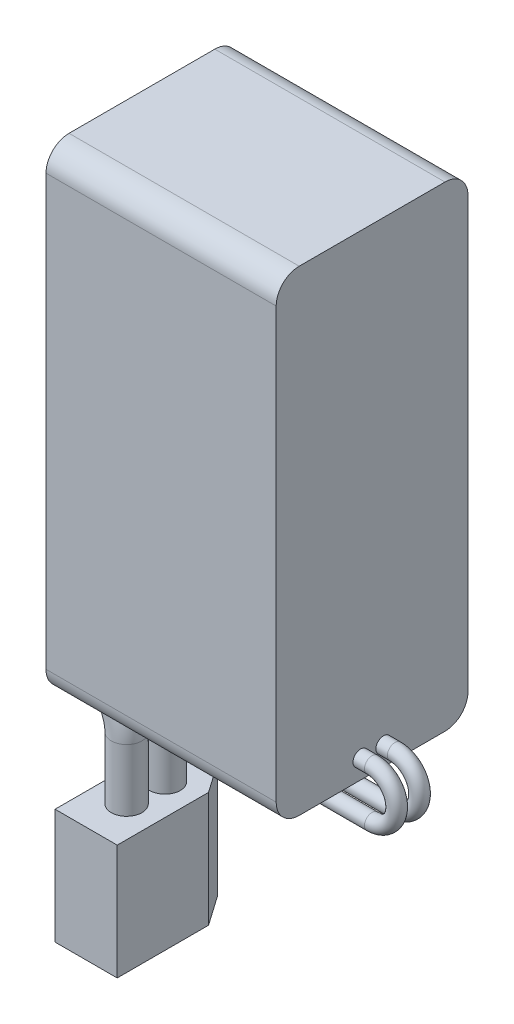
ISO-10303-21;
HEADER;
FILE_DESCRIPTION(('STEP AP214'),'2;1');
FILE_NAME('part.step','',(''),(''),'','','');
FILE_SCHEMA(('AUTOMOTIVE_DESIGN { 1 0 10303 214 1 1 1 1 }'));
ENDSEC;
DATA;
#1=APPLICATION_CONTEXT('core data for automotive mechanical design processes');
#2=APPLICATION_PROTOCOL_DEFINITION('international standard','automotive_design',2000,#1);
#3=PRODUCT_CONTEXT('',#1,'mechanical');
#4=PRODUCT('Part','Part','',(#3));
#5=PRODUCT_RELATED_PRODUCT_CATEGORY('part','',(#4));
#6=PRODUCT_DEFINITION_FORMATION('','',#4);
#7=PRODUCT_DEFINITION_CONTEXT('part definition',#1,'design');
#8=PRODUCT_DEFINITION('design','',#6,#7);
#9=PRODUCT_DEFINITION_SHAPE('','',#8);
#10=(LENGTH_UNIT() NAMED_UNIT(*) SI_UNIT(.MILLI.,.METRE.));
#11=(NAMED_UNIT(*) PLANE_ANGLE_UNIT() SI_UNIT($,.RADIAN.));
#12=(NAMED_UNIT(*) SI_UNIT($,.STERADIAN.) SOLID_ANGLE_UNIT());
#13=UNCERTAINTY_MEASURE_WITH_UNIT(LENGTH_MEASURE(1.E-05),#10,'distance_accuracy_value','');
#14=(GEOMETRIC_REPRESENTATION_CONTEXT(3) GLOBAL_UNCERTAINTY_ASSIGNED_CONTEXT((#13)) GLOBAL_UNIT_ASSIGNED_CONTEXT((#10,
#11,#12)) REPRESENTATION_CONTEXT('',''));
#15=CARTESIAN_POINT('',(0.,0.,0.));
#16=DIRECTION('',(0.,0.,1.));
#17=DIRECTION('',(1.,0.,0.));
#18=AXIS2_PLACEMENT_3D('',#15,#16,#17);
#19=CARTESIAN_POINT('',(15.,31.,25.));
#20=DIRECTION('',(0.,-1.,0.));
#21=DIRECTION('',(0.,0.,-1.));
#22=AXIS2_PLACEMENT_3D('',#19,#20,#21);
#23=PLANE('',#22);
#24=DIRECTION('',(0.,0.,-1.));
#25=VECTOR('',#24,1.);
#26=CARTESIAN_POINT('',(15.,31.,25.));
#27=LINE('',#26,#25);
#28=CARTESIAN_POINT('',(15.,31.,22.));
#29=VERTEX_POINT('',#28);
#30=CARTESIAN_POINT('',(15.,31.,3.));
#31=VERTEX_POINT('',#30);
#32=EDGE_CURVE('E288',#29,#31,#27,.T.);
#33=ORIENTED_EDGE('',*,*,#32,.T.);
#34=DIRECTION('',(-1.,0.,0.));
#35=VECTOR('',#34,1.);
#36=CARTESIAN_POINT('',(-15.,31.,3.));
#37=LINE('',#36,#35);
#38=CARTESIAN_POINT('',(-15.,31.,3.));
#39=VERTEX_POINT('',#38);
#40=EDGE_CURVE('E334',#31,#39,#37,.T.);
#41=ORIENTED_EDGE('',*,*,#40,.T.);
#42=DIRECTION('',(0.,0.,-1.));
#43=VECTOR('',#42,1.);
#44=CARTESIAN_POINT('',(-15.,31.,25.));
#45=LINE('',#44,#43);
#46=CARTESIAN_POINT('',(-15.,31.,22.));
#47=VERTEX_POINT('',#46);
#48=EDGE_CURVE('E301',#47,#39,#45,.T.);
#49=ORIENTED_EDGE('',*,*,#48,.F.);
#50=DIRECTION('',(-1.,0.,0.));
#51=VECTOR('',#50,1.);
#52=CARTESIAN_POINT('',(15.,31.,22.));
#53=LINE('',#52,#51);
#54=EDGE_CURVE('E332',#47,#29,#53,.F.);
#55=ORIENTED_EDGE('',*,*,#54,.T.);
#56=EDGE_LOOP('',(#33,#41,#49,#55));
#57=FACE_BOUND('',#56,.T.);
#58=ADVANCED_FACE('F45',(#57),#23,.F.);
#59=CARTESIAN_POINT('',(-15.,-31.,25.));
#60=DIRECTION('',(1.,0.,0.));
#61=DIRECTION('',(0.,0.,-1.));
#62=AXIS2_PLACEMENT_3D('',#59,#60,#61);
#63=PLANE('',#62);
#64=CARTESIAN_POINT('',(-15.,-28.,15.));
#65=DIRECTION('',(1.,0.,0.));
#66=DIRECTION('',(0.,0.,-1.));
#67=AXIS2_PLACEMENT_3D('',#64,#65,#66);
#68=CIRCLE('',#67,2.);
#69=CARTESIAN_POINT('',(-15.,-28.,13.));
#70=VERTEX_POINT('',#69);
#71=EDGE_CURVE('E257',#70,#70,#68,.F.);
#72=ORIENTED_EDGE('',*,*,#71,.F.);
#73=EDGE_LOOP('',(#72));
#74=FACE_BOUND('',#73,.T.);
#75=CARTESIAN_POINT('',(-15.,-28.,10.));
#76=DIRECTION('',(1.,0.,0.));
#77=DIRECTION('',(0.,0.,-1.));
#78=AXIS2_PLACEMENT_3D('',#75,#76,#77);
#79=CIRCLE('',#78,2.);
#80=CARTESIAN_POINT('',(-15.,-28.,8.));
#81=VERTEX_POINT('',#80);
#82=EDGE_CURVE('E265',#81,#81,#79,.T.);
#83=ORIENTED_EDGE('',*,*,#82,.T.);
#84=EDGE_LOOP('',(#83));
#85=FACE_BOUND('',#84,.T.);
#86=DIRECTION('',(0.,0.,-1.));
#87=VECTOR('',#86,1.);
#88=CARTESIAN_POINT('',(-15.,-31.,25.));
#89=LINE('',#88,#87);
#90=CARTESIAN_POINT('',(-15.,-31.,22.));
#91=VERTEX_POINT('',#90);
#92=CARTESIAN_POINT('',(-15.,-31.,3.));
#93=VERTEX_POINT('',#92);
#94=EDGE_CURVE('E298',#91,#93,#89,.T.);
#95=ORIENTED_EDGE('',*,*,#94,.F.);
#96=CARTESIAN_POINT('',(-15.,-28.,22.));
#97=DIRECTION('',(1.,0.,0.));
#98=DIRECTION('',(0.,0.,-1.));
#99=AXIS2_PLACEMENT_3D('',#96,#97,#98);
#100=CIRCLE('',#99,3.);
#101=CARTESIAN_POINT('',(-15.,-28.,25.));
#102=VERTEX_POINT('',#101);
#103=EDGE_CURVE('E326',#91,#102,#100,.F.);
#104=ORIENTED_EDGE('',*,*,#103,.T.);
#105=DIRECTION('',(0.,-1.,0.));
#106=VECTOR('',#105,1.);
#107=CARTESIAN_POINT('',(-15.,-31.,25.));
#108=LINE('',#107,#106);
#109=CARTESIAN_POINT('',(-15.,28.,25.));
#110=VERTEX_POINT('',#109);
#111=EDGE_CURVE('E281',#110,#102,#108,.T.);
#112=ORIENTED_EDGE('',*,*,#111,.F.);
#113=CARTESIAN_POINT('',(-15.,28.,22.));
#114=DIRECTION('',(1.,0.,0.));
#115=DIRECTION('',(0.,0.,-1.));
#116=AXIS2_PLACEMENT_3D('',#113,#114,#115);
#117=CIRCLE('',#116,3.);
#118=EDGE_CURVE('E68',#110,#47,#117,.F.);
#119=ORIENTED_EDGE('',*,*,#118,.T.);
#120=ORIENTED_EDGE('',*,*,#48,.T.);
#121=CARTESIAN_POINT('',(-15.,28.,3.));
#122=DIRECTION('',(1.,0.,0.));
#123=DIRECTION('',(0.,0.,-1.));
#124=AXIS2_PLACEMENT_3D('',#121,#122,#123);
#125=CIRCLE('',#124,3.);
#126=CARTESIAN_POINT('',(-15.,28.,0.));
#127=VERTEX_POINT('',#126);
#128=EDGE_CURVE('E60',#39,#127,#125,.F.);
#129=ORIENTED_EDGE('',*,*,#128,.T.);
#130=DIRECTION('',(0.,-1.,0.));
#131=VECTOR('',#130,1.);
#132=CARTESIAN_POINT('',(-15.,-31.,0.));
#133=LINE('',#132,#131);
#134=CARTESIAN_POINT('',(-15.,-28.,0.));
#135=VERTEX_POINT('',#134);
#136=EDGE_CURVE('E278',#127,#135,#133,.T.);
#137=ORIENTED_EDGE('',*,*,#136,.T.);
#138=CARTESIAN_POINT('',(-15.,-28.,3.));
#139=DIRECTION('',(1.,0.,0.));
#140=DIRECTION('',(0.,0.,-1.));
#141=AXIS2_PLACEMENT_3D('',#138,#139,#140);
#142=CIRCLE('',#141,3.);
#143=EDGE_CURVE('E324',#135,#93,#142,.F.);
#144=ORIENTED_EDGE('',*,*,#143,.T.);
#145=EDGE_LOOP('',(#95,#104,#112,#119,#120,#129,#137,#144));
#146=FACE_BOUND('',#145,.T.);
#147=ADVANCED_FACE('F340',(#74,#85,#146),#63,.F.);
#148=CARTESIAN_POINT('',(15.,-31.,25.));
#149=DIRECTION('',(0.,1.,0.));
#150=DIRECTION('',(0.,0.,1.));
#151=AXIS2_PLACEMENT_3D('',#148,#149,#150);
#152=PLANE('',#151);
#153=DIRECTION('',(0.,0.,-1.));
#154=VECTOR('',#153,1.);
#155=CARTESIAN_POINT('',(15.,-31.,25.));
#156=LINE('',#155,#154);
#157=CARTESIAN_POINT('',(15.,-31.,22.));
#158=VERTEX_POINT('',#157);
#159=CARTESIAN_POINT('',(15.,-31.,3.));
#160=VERTEX_POINT('',#159);
#161=EDGE_CURVE('E295',#158,#160,#156,.T.);
#162=ORIENTED_EDGE('',*,*,#161,.F.);
#163=DIRECTION('',(1.,0.,0.));
#164=VECTOR('',#163,1.);
#165=CARTESIAN_POINT('',(15.,-31.,22.));
#166=LINE('',#165,#164);
#167=EDGE_CURVE('E320',#158,#91,#166,.F.);
#168=ORIENTED_EDGE('',*,*,#167,.T.);
#169=ORIENTED_EDGE('',*,*,#94,.T.);
#170=DIRECTION('',(1.,0.,0.));
#171=VECTOR('',#170,1.);
#172=CARTESIAN_POINT('',(15.,-31.,3.));
#173=LINE('',#172,#171);
#174=EDGE_CURVE('E317',#93,#160,#173,.T.);
#175=ORIENTED_EDGE('',*,*,#174,.T.);
#176=EDGE_LOOP('',(#162,#168,#169,#175));
#177=FACE_BOUND('',#176,.T.);
#178=ADVANCED_FACE('F343',(#177),#152,.F.);
#179=CARTESIAN_POINT('',(15.,-31.,25.));
#180=DIRECTION('',(-1.,0.,0.));
#181=DIRECTION('',(0.,0.,1.));
#182=AXIS2_PLACEMENT_3D('',#179,#180,#181);
#183=PLANE('',#182);
#184=CARTESIAN_POINT('',(15.,-28.5,11.0084234024653));
#185=DIRECTION('',(-1.,0.,0.));
#186=DIRECTION('',(0.,0.,1.));
#187=AXIS2_PLACEMENT_3D('',#184,#185,#186);
#188=CIRCLE('',#187,1.);
#189=CARTESIAN_POINT('',(15.,-28.5,12.0084234024653));
#190=VERTEX_POINT('',#189);
#191=EDGE_CURVE('E11',#190,#190,#188,.F.);
#192=ORIENTED_EDGE('',*,*,#191,.F.);
#193=EDGE_LOOP('',(#192));
#194=FACE_BOUND('',#193,.T.);
#195=CARTESIAN_POINT('',(15.,-28.5,13.9915765975347));
#196=DIRECTION('',(1.,0.,0.));
#197=DIRECTION('',(0.,0.,-1.));
#198=AXIS2_PLACEMENT_3D('',#195,#196,#197);
#199=CIRCLE('',#198,1.);
#200=CARTESIAN_POINT('',(15.,-28.5,12.9915765975347));
#201=VERTEX_POINT('',#200);
#202=EDGE_CURVE('E53',#201,#201,#199,.T.);
#203=ORIENTED_EDGE('',*,*,#202,.F.);
#204=EDGE_LOOP('',(#203));
#205=FACE_BOUND('',#204,.T.);
#206=DIRECTION('',(0.,1.,0.));
#207=VECTOR('',#206,1.);
#208=CARTESIAN_POINT('',(15.,-31.,25.));
#209=LINE('',#208,#207);
#210=CARTESIAN_POINT('',(15.,-28.,25.));
#211=VERTEX_POINT('',#210);
#212=CARTESIAN_POINT('',(15.,28.,25.));
#213=VERTEX_POINT('',#212);
#214=EDGE_CURVE('E284',#211,#213,#209,.T.);
#215=ORIENTED_EDGE('',*,*,#214,.F.);
#216=CARTESIAN_POINT('',(15.,-28.,22.));
#217=DIRECTION('',(-1.,0.,0.));
#218=DIRECTION('',(0.,0.,1.));
#219=AXIS2_PLACEMENT_3D('',#216,#217,#218);
#220=CIRCLE('',#219,3.);
#221=EDGE_CURVE('E315',#211,#158,#220,.F.);
#222=ORIENTED_EDGE('',*,*,#221,.T.);
#223=ORIENTED_EDGE('',*,*,#161,.T.);
#224=CARTESIAN_POINT('',(15.,-28.,3.));
#225=DIRECTION('',(-1.,0.,0.));
#226=DIRECTION('',(0.,0.,1.));
#227=AXIS2_PLACEMENT_3D('',#224,#225,#226);
#228=CIRCLE('',#227,3.);
#229=CARTESIAN_POINT('',(15.,-28.,0.));
#230=VERTEX_POINT('',#229);
#231=EDGE_CURVE('E313',#160,#230,#228,.F.);
#232=ORIENTED_EDGE('',*,*,#231,.T.);
#233=DIRECTION('',(0.,1.,0.));
#234=VECTOR('',#233,1.);
#235=CARTESIAN_POINT('',(15.,-31.,0.));
#236=LINE('',#235,#234);
#237=CARTESIAN_POINT('',(15.,28.,0.));
#238=VERTEX_POINT('',#237);
#239=EDGE_CURVE('E285',#230,#238,#236,.T.);
#240=ORIENTED_EDGE('',*,*,#239,.T.);
#241=CARTESIAN_POINT('',(15.,28.,3.));
#242=DIRECTION('',(-1.,0.,0.));
#243=DIRECTION('',(0.,0.,1.));
#244=AXIS2_PLACEMENT_3D('',#241,#242,#243);
#245=CIRCLE('',#244,3.);
#246=EDGE_CURVE('E311',#238,#31,#245,.F.);
#247=ORIENTED_EDGE('',*,*,#246,.T.);
#248=ORIENTED_EDGE('',*,*,#32,.F.);
#249=CARTESIAN_POINT('',(15.,28.,22.));
#250=DIRECTION('',(-1.,0.,0.));
#251=DIRECTION('',(0.,0.,1.));
#252=AXIS2_PLACEMENT_3D('',#249,#250,#251);
#253=CIRCLE('',#252,3.);
#254=EDGE_CURVE('E309',#29,#213,#253,.F.);
#255=ORIENTED_EDGE('',*,*,#254,.T.);
#256=EDGE_LOOP('',(#215,#222,#223,#232,#240,#247,#248,#255));
#257=FACE_BOUND('',#256,.T.);
#258=ADVANCED_FACE('F360',(#194,#205,#257),#183,.F.);
#259=CARTESIAN_POINT('',(0.,0.,25.));
#260=DIRECTION('',(0.,0.,-1.));
#261=DIRECTION('',(-1.,0.,0.));
#262=AXIS2_PLACEMENT_3D('',#259,#260,#261);
#263=PLANE('',#262);
#264=ORIENTED_EDGE('',*,*,#111,.T.);
#265=DIRECTION('',(1.,0.,0.));
#266=VECTOR('',#265,1.);
#267=CARTESIAN_POINT('',(0.,-28.,25.));
#268=LINE('',#267,#266);
#269=EDGE_CURVE('E306',#102,#211,#268,.T.);
#270=ORIENTED_EDGE('',*,*,#269,.T.);
#271=ORIENTED_EDGE('',*,*,#214,.T.);
#272=DIRECTION('',(-1.,0.,0.));
#273=VECTOR('',#272,1.);
#274=CARTESIAN_POINT('',(0.,28.,25.));
#275=LINE('',#274,#273);
#276=EDGE_CURVE('E303',#213,#110,#275,.T.);
#277=ORIENTED_EDGE('',*,*,#276,.T.);
#278=EDGE_LOOP('',(#264,#270,#271,#277));
#279=FACE_BOUND('',#278,.T.);
#280=ADVANCED_FACE('F357',(#279),#263,.F.);
#281=CARTESIAN_POINT('',(0.,0.,0.));
#282=DIRECTION('',(0.,0.,-1.));
#283=DIRECTION('',(-1.,0.,0.));
#284=AXIS2_PLACEMENT_3D('',#281,#282,#283);
#285=PLANE('',#284);
#286=ORIENTED_EDGE('',*,*,#239,.F.);
#287=DIRECTION('',(1.,0.,0.));
#288=VECTOR('',#287,1.);
#289=CARTESIAN_POINT('',(-15.,-28.,0.));
#290=LINE('',#289,#288);
#291=EDGE_CURVE('E330',#230,#135,#290,.F.);
#292=ORIENTED_EDGE('',*,*,#291,.T.);
#293=ORIENTED_EDGE('',*,*,#136,.F.);
#294=DIRECTION('',(-1.,0.,0.));
#295=VECTOR('',#294,1.);
#296=CARTESIAN_POINT('',(15.,28.,0.));
#297=LINE('',#296,#295);
#298=EDGE_CURVE('E328',#127,#238,#297,.F.);
#299=ORIENTED_EDGE('',*,*,#298,.T.);
#300=EDGE_LOOP('',(#286,#292,#293,#299));
#301=FACE_BOUND('',#300,.T.);
#302=ADVANCED_FACE('F370',(#301),#285,.T.);
#303=CARTESIAN_POINT('',(0.,-28.,22.));
#304=DIRECTION('',(1.,0.,0.));
#305=DIRECTION('',(0.,0.,-1.));
#306=AXIS2_PLACEMENT_3D('',#303,#304,#305);
#307=CYLINDRICAL_SURFACE('',#306,3.);
#308=ORIENTED_EDGE('',*,*,#103,.F.);
#309=ORIENTED_EDGE('',*,*,#167,.F.);
#310=ORIENTED_EDGE('',*,*,#221,.F.);
#311=ORIENTED_EDGE('',*,*,#269,.F.);
#312=EDGE_LOOP('',(#308,#309,#310,#311));
#313=FACE_BOUND('',#312,.T.);
#314=ADVANCED_FACE('F354',(#313),#307,.T.);
#315=CARTESIAN_POINT('',(15.,-28.,3.));
#316=DIRECTION('',(-1.,0.,0.));
#317=DIRECTION('',(0.,0.,1.));
#318=AXIS2_PLACEMENT_3D('',#315,#316,#317);
#319=CYLINDRICAL_SURFACE('',#318,3.);
#320=ORIENTED_EDGE('',*,*,#143,.F.);
#321=ORIENTED_EDGE('',*,*,#291,.F.);
#322=ORIENTED_EDGE('',*,*,#231,.F.);
#323=ORIENTED_EDGE('',*,*,#174,.F.);
#324=EDGE_LOOP('',(#320,#321,#322,#323));
#325=FACE_BOUND('',#324,.T.);
#326=ADVANCED_FACE('F375',(#325),#319,.T.);
#327=CARTESIAN_POINT('',(15.,28.,3.));
#328=DIRECTION('',(1.,0.,0.));
#329=DIRECTION('',(0.,0.,-1.));
#330=AXIS2_PLACEMENT_3D('',#327,#328,#329);
#331=CYLINDRICAL_SURFACE('',#330,3.);
#332=ORIENTED_EDGE('',*,*,#246,.F.);
#333=ORIENTED_EDGE('',*,*,#298,.F.);
#334=ORIENTED_EDGE('',*,*,#128,.F.);
#335=ORIENTED_EDGE('',*,*,#40,.F.);
#336=EDGE_LOOP('',(#332,#333,#334,#335));
#337=FACE_BOUND('',#336,.T.);
#338=ADVANCED_FACE('F373',(#337),#331,.T.);
#339=CARTESIAN_POINT('',(0.,28.,22.));
#340=DIRECTION('',(-1.,0.,0.));
#341=DIRECTION('',(0.,0.,1.));
#342=AXIS2_PLACEMENT_3D('',#339,#340,#341);
#343=CYLINDRICAL_SURFACE('',#342,3.);
#344=ORIENTED_EDGE('',*,*,#254,.F.);
#345=ORIENTED_EDGE('',*,*,#54,.F.);
#346=ORIENTED_EDGE('',*,*,#118,.F.);
#347=ORIENTED_EDGE('',*,*,#276,.F.);
#348=EDGE_LOOP('',(#344,#345,#346,#347));
#349=FACE_BOUND('',#348,.T.);
#350=ADVANCED_FACE('F47',(#349),#343,.T.);
#351=CARTESIAN_POINT('',(-15.,-28.,10.));
#352=DIRECTION('',(-1.,0.,0.));
#353=DIRECTION('',(0.,-1.,0.));
#354=AXIS2_PLACEMENT_3D('',#351,#352,#353);
#355=CYLINDRICAL_SURFACE('',#354,2.);
#356=CARTESIAN_POINT('',(-17.641817009081,-28.,10.));
#357=DIRECTION('',(1.,0.,0.));
#358=DIRECTION('',(0.,0.,-1.));
#359=AXIS2_PLACEMENT_3D('',#356,#357,#358);
#360=CIRCLE('',#359,2.);
#361=CARTESIAN_POINT('',(-17.641817009081,-26.,10.));
#362=VERTEX_POINT('',#361);
#363=EDGE_CURVE('E269',#362,#362,#360,.T.);
#364=ORIENTED_EDGE('',*,*,#363,.T.);
#365=EDGE_LOOP('',(#364));
#366=FACE_BOUND('',#365,.T.);
#367=ORIENTED_EDGE('',*,*,#82,.F.);
#368=EDGE_LOOP('',(#367));
#369=FACE_BOUND('',#368,.T.);
#370=ADVANCED_FACE('F395',(#366,#369),#355,.T.);
#371=CARTESIAN_POINT('',(-17.641817009081,-31.0720427470335,10.));
#372=DIRECTION('',(0.,0.,1.));
#373=DIRECTION('',(1.,0.,0.));
#374=AXIS2_PLACEMENT_3D('',#371,#372,#373);
#375=TOROIDAL_SURFACE('',#374,3.07204274703344,2.);
#376=CARTESIAN_POINT('',(-18.6550859519059,-33.9721690699903,10.));
#377=DIRECTION('',(-0.944038401079349,0.32983556098084,0.));
#378=DIRECTION('',(0.,0.,-1.));
#379=AXIS2_PLACEMENT_3D('',#376,#377,#378);
#380=CIRCLE('',#379,2.);
#381=CARTESIAN_POINT('',(-19.3147570738676,-35.860245872149,10.));
#382=VERTEX_POINT('',#381);
#383=EDGE_CURVE('E272',#382,#382,#380,.T.);
#384=CARTESIAN_POINT('',(-17.641817009081,-31.0720427470335,10.));
#385=DIRECTION('',(0.,0.,1.));
#386=DIRECTION('',(1.,0.,0.));
#387=AXIS2_PLACEMENT_3D('',#384,#385,#386);
#388=CIRCLE('',#387,5.07204274703344);
#389=EDGE_CURVE('',#362,#382,#388,.T.);
#390=ORIENTED_EDGE('',*,*,#363,.F.);
#391=ORIENTED_EDGE('',*,*,#383,.T.);
#392=ORIENTED_EDGE('',*,*,#389,.T.);
#393=ORIENTED_EDGE('',*,*,#389,.F.);
#394=EDGE_LOOP('',(#390,#392,#391,#393));
#395=FACE_BOUND('',#394,.T.);
#396=ADVANCED_FACE('F400',(#395),#375,.T.);
#397=CARTESIAN_POINT('',(-20.7026879756752,-39.8327104100987,10.));
#398=DIRECTION('',(0.,0.,-1.));
#399=DIRECTION('',(-1.,0.,0.));
#400=AXIS2_PLACEMENT_3D('',#397,#398,#399);
#401=TOROIDAL_SURFACE('',#400,6.20794803835082,2.);
#402=CARTESIAN_POINT('',(-14.4947399373244,-39.8327104100987,10.));
#403=DIRECTION('',(0.,1.,0.));
#404=DIRECTION('',(0.,0.,-1.));
#405=AXIS2_PLACEMENT_3D('',#402,#403,#404);
#406=CIRCLE('',#405,2.);
#407=CARTESIAN_POINT('',(-14.4947399373244,-39.8327104100987,8.));
#408=VERTEX_POINT('',#407);
#409=EDGE_CURVE('E275',#408,#408,#406,.T.);
#410=ORIENTED_EDGE('',*,*,#409,.T.);
#411=EDGE_LOOP('',(#410));
#412=FACE_BOUND('',#411,.T.);
#413=ORIENTED_EDGE('',*,*,#383,.F.);
#414=EDGE_LOOP('',(#413));
#415=FACE_BOUND('',#414,.T.);
#416=ADVANCED_FACE('F405',(#412,#415),#401,.T.);
#417=CARTESIAN_POINT('',(-14.4947399373244,-39.8327104100987,10.));
#418=DIRECTION('',(0.,-1.,0.));
#419=DIRECTION('',(0.,0.,-1.));
#420=AXIS2_PLACEMENT_3D('',#417,#418,#419);
#421=CYLINDRICAL_SURFACE('',#420,2.);
#422=CARTESIAN_POINT('',(-14.4947399373244,-47.9298782578432,10.));
#423=DIRECTION('',(0.,1.,0.));
#424=DIRECTION('',(0.,0.,-1.));
#425=AXIS2_PLACEMENT_3D('',#422,#423,#424);
#426=CIRCLE('',#425,2.);
#427=CARTESIAN_POINT('',(-14.4947399373244,-47.9298782578432,8.));
#428=VERTEX_POINT('',#427);
#429=EDGE_CURVE('E200',#428,#428,#426,.T.);
#430=ORIENTED_EDGE('',*,*,#429,.T.);
#431=EDGE_LOOP('',(#430));
#432=FACE_BOUND('',#431,.T.);
#433=ORIENTED_EDGE('',*,*,#409,.F.);
#434=EDGE_LOOP('',(#433));
#435=FACE_BOUND('',#434,.T.);
#436=ADVANCED_FACE('F396',(#432,#435),#421,.T.);
#437=CARTESIAN_POINT('',(-15.,-28.,15.));
#438=DIRECTION('',(-1.,0.,0.));
#439=DIRECTION('',(0.,-1.,0.));
#440=AXIS2_PLACEMENT_3D('',#437,#438,#439);
#441=CYLINDRICAL_SURFACE('',#440,2.);
#442=CARTESIAN_POINT('',(-17.641817009081,-28.,15.));
#443=DIRECTION('',(1.,0.,0.));
#444=DIRECTION('',(0.,0.,-1.));
#445=AXIS2_PLACEMENT_3D('',#442,#443,#444);
#446=CIRCLE('',#445,2.);
#447=CARTESIAN_POINT('',(-17.641817009081,-26.,15.));
#448=VERTEX_POINT('',#447);
#449=EDGE_CURVE('E254',#448,#448,#446,.T.);
#450=ORIENTED_EDGE('',*,*,#449,.T.);
#451=EDGE_LOOP('',(#450));
#452=FACE_BOUND('',#451,.T.);
#453=ORIENTED_EDGE('',*,*,#71,.T.);
#454=EDGE_LOOP('',(#453));
#455=FACE_BOUND('',#454,.T.);
#456=ADVANCED_FACE('F338',(#452,#455),#441,.T.);
#457=CARTESIAN_POINT('',(-17.641817009081,-31.0720427470335,15.));
#458=DIRECTION('',(0.,0.,1.));
#459=DIRECTION('',(1.,0.,0.));
#460=AXIS2_PLACEMENT_3D('',#457,#458,#459);
#461=TOROIDAL_SURFACE('',#460,3.07204274703344,2.);
#462=CARTESIAN_POINT('',(-18.6550859519059,-33.9721690699903,15.));
#463=DIRECTION('',(-0.944038401079349,0.32983556098084,0.));
#464=DIRECTION('',(0.,0.,-1.));
#465=AXIS2_PLACEMENT_3D('',#462,#463,#464);
#466=CIRCLE('',#465,2.);
#467=CARTESIAN_POINT('',(-19.3147570738676,-35.860245872149,15.));
#468=VERTEX_POINT('',#467);
#469=EDGE_CURVE('E260',#468,#468,#466,.T.);
#470=CARTESIAN_POINT('',(-17.641817009081,-31.0720427470335,15.));
#471=DIRECTION('',(0.,0.,1.));
#472=DIRECTION('',(1.,0.,0.));
#473=AXIS2_PLACEMENT_3D('',#470,#471,#472);
#474=CIRCLE('',#473,5.07204274703345);
#475=EDGE_CURVE('',#448,#468,#474,.T.);
#476=ORIENTED_EDGE('',*,*,#449,.F.);
#477=ORIENTED_EDGE('',*,*,#469,.T.);
#478=ORIENTED_EDGE('',*,*,#475,.T.);
#479=ORIENTED_EDGE('',*,*,#475,.F.);
#480=EDGE_LOOP('',(#476,#478,#477,#479));
#481=FACE_BOUND('',#480,.T.);
#482=ADVANCED_FACE('F412',(#481),#461,.T.);
#483=CARTESIAN_POINT('',(-20.7026879756752,-39.8327104100987,15.));
#484=DIRECTION('',(0.,0.,-1.));
#485=DIRECTION('',(-1.,0.,0.));
#486=AXIS2_PLACEMENT_3D('',#483,#484,#485);
#487=TOROIDAL_SURFACE('',#486,6.20794803835082,2.);
#488=CARTESIAN_POINT('',(-14.4947399373244,-39.8327104100987,15.));
#489=DIRECTION('',(0.,1.,0.));
#490=DIRECTION('',(0.,0.,-1.));
#491=AXIS2_PLACEMENT_3D('',#488,#489,#490);
#492=CIRCLE('',#491,2.);
#493=CARTESIAN_POINT('',(-14.4947399373244,-39.8327104100987,13.));
#494=VERTEX_POINT('',#493);
#495=EDGE_CURVE('E263',#494,#494,#492,.T.);
#496=ORIENTED_EDGE('',*,*,#495,.T.);
#497=EDGE_LOOP('',(#496));
#498=FACE_BOUND('',#497,.T.);
#499=ORIENTED_EDGE('',*,*,#469,.F.);
#500=EDGE_LOOP('',(#499));
#501=FACE_BOUND('',#500,.T.);
#502=ADVANCED_FACE('F486',(#498,#501),#487,.T.);
#503=CARTESIAN_POINT('',(-14.4947399373244,-39.8327104100987,15.));
#504=DIRECTION('',(0.,-1.,0.));
#505=DIRECTION('',(0.,0.,-1.));
#506=AXIS2_PLACEMENT_3D('',#503,#504,#505);
#507=CYLINDRICAL_SURFACE('',#506,2.);
#508=CARTESIAN_POINT('',(-14.4947399373244,-47.9298782578432,15.));
#509=DIRECTION('',(0.,1.,0.));
#510=DIRECTION('',(0.,0.,-1.));
#511=AXIS2_PLACEMENT_3D('',#508,#509,#510);
#512=CIRCLE('',#511,2.);
#513=CARTESIAN_POINT('',(-14.4947399373244,-47.9298782578432,13.));
#514=VERTEX_POINT('',#513);
#515=EDGE_CURVE('E197',#514,#514,#512,.T.);
#516=ORIENTED_EDGE('',*,*,#515,.T.);
#517=EDGE_LOOP('',(#516));
#518=FACE_BOUND('',#517,.T.);
#519=ORIENTED_EDGE('',*,*,#495,.F.);
#520=EDGE_LOOP('',(#519));
#521=FACE_BOUND('',#520,.T.);
#522=ADVANCED_FACE('F403',(#518,#521),#507,.T.);
#523=CARTESIAN_POINT('',(-6.42316074121552,-34.9000501906313,13.9915765975347));
#524=DIRECTION('',(1.,0.,0.));
#525=DIRECTION('',(0.,0.,-1.));
#526=AXIS2_PLACEMENT_3D('',#523,#524,#525);
#527=CYLINDRICAL_SURFACE('',#526,1.);
#528=CARTESIAN_POINT('',(16.4977245481168,-34.9000501906313,13.9915765975347));
#529=DIRECTION('',(-1.,0.,0.));
#530=DIRECTION('',(0.,0.,-1.));
#531=AXIS2_PLACEMENT_3D('',#528,#529,#530);
#532=CIRCLE('',#531,1.);
#533=CARTESIAN_POINT('',(16.4977245481168,-35.9000501906313,13.9915765975347));
#534=VERTEX_POINT('',#533);
#535=EDGE_CURVE('E248',#534,#534,#532,.T.);
#536=ORIENTED_EDGE('',*,*,#535,.T.);
#537=EDGE_LOOP('',(#536));
#538=FACE_BOUND('',#537,.T.);
#539=CARTESIAN_POINT('',(-6.42316074121552,-34.9000501906313,13.9915765975347));
#540=DIRECTION('',(-1.,0.,0.));
#541=DIRECTION('',(0.,0.,-1.));
#542=AXIS2_PLACEMENT_3D('',#539,#540,#541);
#543=CIRCLE('',#542,1.);
#544=CARTESIAN_POINT('',(-6.42316074121552,-34.9000501906313,12.9915765975347));
#545=VERTEX_POINT('',#544);
#546=EDGE_CURVE('E245',#545,#545,#543,.T.);
#547=ORIENTED_EDGE('',*,*,#546,.F.);
#548=EDGE_LOOP('',(#547));
#549=FACE_BOUND('',#548,.T.);
#550=ADVANCED_FACE('F505',(#538,#549),#527,.T.);
#551=CARTESIAN_POINT('',(16.4977245481168,-31.7000250953156,13.9915765975347));
#552=DIRECTION('',(0.,0.,1.));
#553=DIRECTION('',(1.,0.,0.));
#554=AXIS2_PLACEMENT_3D('',#551,#552,#553);
#555=TOROIDAL_SURFACE('',#554,3.20002509531564,1.);
#556=CARTESIAN_POINT('',(16.4977245481169,-28.5,13.9915765975347));
#557=DIRECTION('',(1.,0.,0.));
#558=DIRECTION('',(0.,0.,-1.));
#559=AXIS2_PLACEMENT_3D('',#556,#557,#558);
#560=CIRCLE('',#559,1.);
#561=CARTESIAN_POINT('',(16.4977245481169,-27.5,13.9915765975347));
#562=VERTEX_POINT('',#561);
#563=EDGE_CURVE('E251',#562,#562,#560,.T.);
#564=CARTESIAN_POINT('',(16.4977245481168,-31.7000250953156,13.9915765975347));
#565=DIRECTION('',(0.,0.,1.));
#566=DIRECTION('',(1.,0.,0.));
#567=AXIS2_PLACEMENT_3D('',#564,#565,#566);
#568=CIRCLE('',#567,4.20002509531564);
#569=EDGE_CURVE('',#534,#562,#568,.T.);
#570=ORIENTED_EDGE('',*,*,#535,.F.);
#571=ORIENTED_EDGE('',*,*,#563,.T.);
#572=ORIENTED_EDGE('',*,*,#569,.T.);
#573=ORIENTED_EDGE('',*,*,#569,.F.);
#574=EDGE_LOOP('',(#570,#572,#571,#573));
#575=FACE_BOUND('',#574,.T.);
#576=ADVANCED_FACE('F515',(#575),#555,.T.);
#577=CARTESIAN_POINT('',(16.4977245481168,-28.5,13.9915765975347));
#578=DIRECTION('',(-1.,0.,0.));
#579=DIRECTION('',(0.,-1.,0.));
#580=AXIS2_PLACEMENT_3D('',#577,#578,#579);
#581=CYLINDRICAL_SURFACE('',#580,1.);
#582=ORIENTED_EDGE('',*,*,#202,.T.);
#583=EDGE_LOOP('',(#582));
#584=FACE_BOUND('',#583,.T.);
#585=ORIENTED_EDGE('',*,*,#563,.F.);
#586=EDGE_LOOP('',(#585));
#587=FACE_BOUND('',#586,.T.);
#588=ADVANCED_FACE('F415',(#584,#587),#581,.T.);
#589=CARTESIAN_POINT('',(-6.42316074121552,-34.9000501906313,11.0084234024653));
#590=DIRECTION('',(1.,0.,0.));
#591=DIRECTION('',(0.,0.,-1.));
#592=AXIS2_PLACEMENT_3D('',#589,#590,#591);
#593=CYLINDRICAL_SURFACE('',#592,1.);
#594=CARTESIAN_POINT('',(16.4977245481168,-34.9000501906313,11.0084234024653));
#595=DIRECTION('',(-1.,0.,0.));
#596=DIRECTION('',(0.,0.,-1.));
#597=AXIS2_PLACEMENT_3D('',#594,#595,#596);
#598=CIRCLE('',#597,1.);
#599=CARTESIAN_POINT('',(16.4977245481168,-35.9000501906313,11.0084234024653));
#600=VERTEX_POINT('',#599);
#601=EDGE_CURVE('E239',#600,#600,#598,.T.);
#602=ORIENTED_EDGE('',*,*,#601,.T.);
#603=EDGE_LOOP('',(#602));
#604=FACE_BOUND('',#603,.T.);
#605=CARTESIAN_POINT('',(-6.42316074121552,-34.9000501906313,11.0084234024653));
#606=DIRECTION('',(-1.,0.,0.));
#607=DIRECTION('',(0.,0.,-1.));
#608=AXIS2_PLACEMENT_3D('',#605,#606,#607);
#609=CIRCLE('',#608,1.);
#610=CARTESIAN_POINT('',(-6.42316074121552,-34.9000501906313,10.0084234024653));
#611=VERTEX_POINT('',#610);
#612=EDGE_CURVE('E219',#611,#611,#609,.T.);
#613=ORIENTED_EDGE('',*,*,#612,.F.);
#614=EDGE_LOOP('',(#613));
#615=FACE_BOUND('',#614,.T.);
#616=ADVANCED_FACE('F535',(#604,#615),#593,.T.);
#617=CARTESIAN_POINT('',(16.4977245481168,-31.7000250953156,11.0084234024653));
#618=DIRECTION('',(0.,0.,1.));
#619=DIRECTION('',(1.,0.,0.));
#620=AXIS2_PLACEMENT_3D('',#617,#618,#619);
#621=TOROIDAL_SURFACE('',#620,3.20002509531564,1.);
#622=CARTESIAN_POINT('',(16.4977245481169,-28.5,11.0084234024653));
#623=DIRECTION('',(1.,0.,0.));
#624=DIRECTION('',(0.,0.,-1.));
#625=AXIS2_PLACEMENT_3D('',#622,#623,#624);
#626=CIRCLE('',#625,1.);
#627=CARTESIAN_POINT('',(16.4977245481169,-27.5,11.0084234024653));
#628=VERTEX_POINT('',#627);
#629=EDGE_CURVE('E242',#628,#628,#626,.T.);
#630=CARTESIAN_POINT('',(16.4977245481168,-31.7000250953156,11.0084234024653));
#631=DIRECTION('',(0.,0.,1.));
#632=DIRECTION('',(1.,0.,0.));
#633=AXIS2_PLACEMENT_3D('',#630,#631,#632);
#634=CIRCLE('',#633,4.20002509531564);
#635=EDGE_CURVE('',#600,#628,#634,.T.);
#636=ORIENTED_EDGE('',*,*,#601,.F.);
#637=ORIENTED_EDGE('',*,*,#629,.T.);
#638=ORIENTED_EDGE('',*,*,#635,.T.);
#639=ORIENTED_EDGE('',*,*,#635,.F.);
#640=EDGE_LOOP('',(#636,#638,#637,#639));
#641=FACE_BOUND('',#640,.T.);
#642=ADVANCED_FACE('F545',(#641),#621,.T.);
#643=CARTESIAN_POINT('',(16.4977245481168,-28.5,11.0084234024653));
#644=DIRECTION('',(-1.,0.,0.));
#645=DIRECTION('',(0.,-1.,0.));
#646=AXIS2_PLACEMENT_3D('',#643,#644,#645);
#647=CYLINDRICAL_SURFACE('',#646,1.);
#648=ORIENTED_EDGE('',*,*,#191,.T.);
#649=EDGE_LOOP('',(#648));
#650=FACE_BOUND('',#649,.T.);
#651=ORIENTED_EDGE('',*,*,#629,.F.);
#652=EDGE_LOOP('',(#651));
#653=FACE_BOUND('',#652,.T.);
#654=ADVANCED_FACE('F518',(#650,#653),#647,.T.);
#655=CARTESIAN_POINT('',(-6.42316074121552,-36.4000501906313,9.5));
#656=DIRECTION('',(-0.0523359562429463,-0.998629534754574,0.));
#657=DIRECTION('',(0.998629534754574,-0.0523359562429463,0.));
#658=AXIS2_PLACEMENT_3D('',#655,#656,#657);
#659=PLANE('',#658);
#660=DIRECTION('',(0.,0.,1.));
#661=VECTOR('',#660,1.);
#662=CARTESIAN_POINT('',(-6.42316074121552,-36.4000501906313,9.5));
#663=LINE('',#662,#661);
#664=CARTESIAN_POINT('',(-6.42316074121552,-36.4000501906313,9.5));
#665=VERTEX_POINT('',#664);
#666=CARTESIAN_POINT('',(-6.42316074121552,-36.4000501906313,15.5));
#667=VERTEX_POINT('',#666);
#668=EDGE_CURVE('E206',#665,#667,#663,.T.);
#669=ORIENTED_EDGE('',*,*,#668,.T.);
#670=DIRECTION('',(0.997264688634237,-0.0522644276887163,0.052264427688714));
#671=VECTOR('',#670,1.);
#672=CARTESIAN_POINT('',(-6.57952514583242,-36.3918554794264,15.4918052887951));
#673=LINE('',#672,#671);
#674=CARTESIAN_POINT('',(-9.92316074121552,-36.2166229631406,15.3165727725094));
#675=VERTEX_POINT('',#674);
#676=EDGE_CURVE('E216',#675,#667,#673,.T.);
#677=ORIENTED_EDGE('',*,*,#676,.F.);
#678=DIRECTION('',(0.,0.,-1.));
#679=VECTOR('',#678,1.);
#680=CARTESIAN_POINT('',(-9.92316074121552,-36.2166229631406,0.));
#681=LINE('',#680,#679);
#682=CARTESIAN_POINT('',(-9.92316074121552,-36.2166229631406,9.68342722749064));
#683=VERTEX_POINT('',#682);
#684=EDGE_CURVE('E215',#683,#675,#681,.F.);
#685=ORIENTED_EDGE('',*,*,#684,.F.);
#686=DIRECTION('',(0.997264688634237,-0.0522644276887163,-0.052264427688714));
#687=VECTOR('',#686,1.);
#688=CARTESIAN_POINT('',(-6.42316074121552,-36.4000501906313,9.5));
#689=LINE('',#688,#687);
#690=EDGE_CURVE('E221',#683,#665,#689,.T.);
#691=ORIENTED_EDGE('',*,*,#690,.T.);
#692=EDGE_LOOP('',(#669,#677,#685,#691));
#693=FACE_BOUND('',#692,.T.);
#694=ADVANCED_FACE('F548',(#693),#659,.T.);
#695=CARTESIAN_POINT('',(-6.42316074121552,-33.4000501906313,15.5));
#696=DIRECTION('',(-0.0523359562429439,0.,0.998629534754574));
#697=DIRECTION('',(0.998629534754574,0.,0.052335956242944));
#698=AXIS2_PLACEMENT_3D('',#695,#696,#697);
#699=PLANE('',#698);
#700=DIRECTION('',(0.,1.,0.));
#701=VECTOR('',#700,1.);
#702=CARTESIAN_POINT('',(-6.42316074121552,-33.4000501906313,15.5));
#703=LINE('',#702,#701);
#704=CARTESIAN_POINT('',(-6.42316074121552,-33.4000501906313,15.5));
#705=VERTEX_POINT('',#704);
#706=EDGE_CURVE('E209',#667,#705,#703,.T.);
#707=ORIENTED_EDGE('',*,*,#706,.T.);
#708=DIRECTION('',(0.997264688634237,0.0522644276887117,0.052264427688714));
#709=VECTOR('',#708,1.);
#710=CARTESIAN_POINT('',(-6.73588955044931,-33.416439613041,15.4836105775902));
#711=LINE('',#710,#709);
#712=CARTESIAN_POINT('',(-9.92316074121552,-33.5834774181219,15.3165727725094));
#713=VERTEX_POINT('',#712);
#714=EDGE_CURVE('E220',#713,#705,#711,.T.);
#715=ORIENTED_EDGE('',*,*,#714,.F.);
#716=DIRECTION('',(0.,-1.,0.));
#717=VECTOR('',#716,1.);
#718=CARTESIAN_POINT('',(-9.92316074121544,0.,15.3165727725094));
#719=LINE('',#718,#717);
#720=EDGE_CURVE('E232',#675,#713,#719,.F.);
#721=ORIENTED_EDGE('',*,*,#720,.F.);
#722=ORIENTED_EDGE('',*,*,#676,.T.);
#723=EDGE_LOOP('',(#707,#715,#721,#722));
#724=FACE_BOUND('',#723,.T.);
#725=ADVANCED_FACE('F574',(#724),#699,.T.);
#726=CARTESIAN_POINT('',(-6.42316074121552,-33.4000501906313,9.5));
#727=DIRECTION('',(-0.0523359562429416,0.998629534754574,0.));
#728=DIRECTION('',(-0.998629534754574,-0.0523359562429416,0.));
#729=AXIS2_PLACEMENT_3D('',#726,#727,#728);
#730=PLANE('',#729);
#731=DIRECTION('',(0.,0.,-1.));
#732=VECTOR('',#731,1.);
#733=CARTESIAN_POINT('',(-6.42316074121552,-33.4000501906313,9.5));
#734=LINE('',#733,#732);
#735=CARTESIAN_POINT('',(-6.42316074121552,-33.4000501906313,9.5));
#736=VERTEX_POINT('',#735);
#737=EDGE_CURVE('E211',#705,#736,#734,.T.);
#738=ORIENTED_EDGE('',*,*,#737,.T.);
#739=DIRECTION('',(0.997264688634237,0.0522644276887117,-0.052264427688714));
#740=VECTOR('',#739,1.);
#741=CARTESIAN_POINT('',(-6.42316074121552,-33.4000501906313,9.5));
#742=LINE('',#741,#740);
#743=CARTESIAN_POINT('',(-9.92316074121552,-33.5834774181219,9.68342722749064));
#744=VERTEX_POINT('',#743);
#745=EDGE_CURVE('E224',#744,#736,#742,.T.);
#746=ORIENTED_EDGE('',*,*,#745,.F.);
#747=DIRECTION('',(0.,0.,1.));
#748=VECTOR('',#747,1.);
#749=CARTESIAN_POINT('',(-9.92316074121552,-33.5834774181219,0.));
#750=LINE('',#749,#748);
#751=EDGE_CURVE('E234',#713,#744,#750,.F.);
#752=ORIENTED_EDGE('',*,*,#751,.F.);
#753=ORIENTED_EDGE('',*,*,#714,.T.);
#754=EDGE_LOOP('',(#738,#746,#752,#753));
#755=FACE_BOUND('',#754,.T.);
#756=ADVANCED_FACE('F584',(#755),#730,.T.);
#757=CARTESIAN_POINT('',(-6.42316074121552,-33.4000501906313,9.5));
#758=DIRECTION('',(-0.0523359562429439,0.,-0.998629534754574));
#759=DIRECTION('',(-0.998629534754574,0.,0.052335956242944));
#760=AXIS2_PLACEMENT_3D('',#757,#758,#759);
#761=PLANE('',#760);
#762=DIRECTION('',(0.,-1.,0.));
#763=VECTOR('',#762,1.);
#764=CARTESIAN_POINT('',(-6.42316074121552,-33.4000501906313,9.5));
#765=LINE('',#764,#763);
#766=EDGE_CURVE('E213',#736,#665,#765,.T.);
#767=ORIENTED_EDGE('',*,*,#766,.T.);
#768=ORIENTED_EDGE('',*,*,#690,.F.);
#769=DIRECTION('',(0.,1.,0.));
#770=VECTOR('',#769,1.);
#771=CARTESIAN_POINT('',(-9.92316074121544,0.,9.68342722749064));
#772=LINE('',#771,#770);
#773=EDGE_CURVE('E225',#744,#683,#772,.F.);
#774=ORIENTED_EDGE('',*,*,#773,.F.);
#775=ORIENTED_EDGE('',*,*,#745,.T.);
#776=EDGE_LOOP('',(#767,#768,#774,#775));
#777=FACE_BOUND('',#776,.T.);
#778=ADVANCED_FACE('F594',(#777),#761,.T.);
#779=CARTESIAN_POINT('',(-9.92316074121544,0.,0.));
#780=DIRECTION('',(1.,0.,0.));
#781=DIRECTION('',(0.,1.,0.));
#782=AXIS2_PLACEMENT_3D('',#779,#780,#781);
#783=PLANE('',#782);
#784=ORIENTED_EDGE('',*,*,#684,.T.);
#785=ORIENTED_EDGE('',*,*,#720,.T.);
#786=ORIENTED_EDGE('',*,*,#751,.T.);
#787=ORIENTED_EDGE('',*,*,#773,.T.);
#788=EDGE_LOOP('',(#784,#785,#786,#787));
#789=FACE_BOUND('',#788,.T.);
#790=ADVANCED_FACE('F604',(#789),#783,.F.);
#791=CARTESIAN_POINT('',(-6.42316074121544,0.,0.));
#792=DIRECTION('',(1.,0.,0.));
#793=DIRECTION('',(0.,1.,0.));
#794=AXIS2_PLACEMENT_3D('',#791,#792,#793);
#795=PLANE('',#794);
#796=ORIENTED_EDGE('',*,*,#546,.T.);
#797=EDGE_LOOP('',(#796));
#798=FACE_BOUND('',#797,.T.);
#799=ORIENTED_EDGE('',*,*,#612,.T.);
#800=EDGE_LOOP('',(#799));
#801=FACE_BOUND('',#800,.T.);
#802=ORIENTED_EDGE('',*,*,#668,.F.);
#803=ORIENTED_EDGE('',*,*,#766,.F.);
#804=ORIENTED_EDGE('',*,*,#737,.F.);
#805=ORIENTED_EDGE('',*,*,#706,.F.);
#806=EDGE_LOOP('',(#802,#803,#804,#805));
#807=FACE_BOUND('',#806,.T.);
#808=ADVANCED_FACE('F614',(#798,#801,#807),#795,.T.);
#809=CARTESIAN_POINT('',(-10.4447399373244,-62.9298782578432,8.36912836930281));
#810=DIRECTION('',(-1.,0.,0.));
#811=DIRECTION('',(0.,-1.,0.));
#812=AXIS2_PLACEMENT_3D('',#809,#810,#811);
#813=PLANE('',#812);
#814=DIRECTION('',(0.,0.,1.));
#815=VECTOR('',#814,1.);
#816=CARTESIAN_POINT('',(-10.4447399373244,-47.9298782578432,8.36912836930281));
#817=LINE('',#816,#815);
#818=CARTESIAN_POINT('',(-10.4447399373244,-47.9298782578432,8.36912836930281));
#819=VERTEX_POINT('',#818);
#820=CARTESIAN_POINT('',(-10.4447399373244,-47.9298782578432,20.2760125212192));
#821=VERTEX_POINT('',#820);
#822=EDGE_CURVE('E196',#819,#821,#817,.T.);
#823=ORIENTED_EDGE('',*,*,#822,.T.);
#824=DIRECTION('',(0.,1.,0.));
#825=VECTOR('',#824,1.);
#826=CARTESIAN_POINT('',(-10.4447399373244,-62.9298782578432,20.2760125212192));
#827=LINE('',#826,#825);
#828=CARTESIAN_POINT('',(-10.4447399373244,-62.9298782578432,20.2760125212192));
#829=VERTEX_POINT('',#828);
#830=EDGE_CURVE('E176',#829,#821,#827,.T.);
#831=ORIENTED_EDGE('',*,*,#830,.F.);
#832=DIRECTION('',(0.,0.,1.));
#833=VECTOR('',#832,1.);
#834=CARTESIAN_POINT('',(-10.4447399373244,-62.9298782578432,8.36912836930281));
#835=LINE('',#834,#833);
#836=CARTESIAN_POINT('',(-10.4447399373244,-62.9298782578432,8.36912836930281));
#837=VERTEX_POINT('',#836);
#838=EDGE_CURVE('E183',#837,#829,#835,.T.);
#839=ORIENTED_EDGE('',*,*,#838,.F.);
#840=DIRECTION('',(0.,1.,0.));
#841=VECTOR('',#840,1.);
#842=CARTESIAN_POINT('',(-10.4447399373244,-62.9298782578432,8.36912836930281));
#843=LINE('',#842,#841);
#844=EDGE_CURVE('E921',#837,#819,#843,.T.);
#845=ORIENTED_EDGE('',*,*,#844,.T.);
#846=EDGE_LOOP('',(#823,#831,#839,#845));
#847=FACE_BOUND('',#846,.T.);
#848=ADVANCED_FACE('F194',(#847),#813,.F.);
#849=CARTESIAN_POINT('',(-18.5447399373244,-62.9298782578432,20.2760125212192));
#850=DIRECTION('',(0.,0.,-1.));
#851=DIRECTION('',(-1.,0.,0.));
#852=AXIS2_PLACEMENT_3D('',#849,#850,#851);
#853=PLANE('',#852);
#854=DIRECTION('',(-1.,0.,0.));
#855=VECTOR('',#854,1.);
#856=CARTESIAN_POINT('',(-18.5447399373244,-47.9298782578432,20.2760125212192));
#857=LINE('',#856,#855);
#858=CARTESIAN_POINT('',(-18.5447399373244,-47.9298782578432,20.2760125212192));
#859=VERTEX_POINT('',#858);
#860=EDGE_CURVE('E908',#821,#859,#857,.T.);
#861=ORIENTED_EDGE('',*,*,#860,.T.);
#862=DIRECTION('',(0.,1.,0.));
#863=VECTOR('',#862,1.);
#864=CARTESIAN_POINT('',(-18.5447399373244,-62.9298782578432,20.2760125212192));
#865=LINE('',#864,#863);
#866=CARTESIAN_POINT('',(-18.5447399373244,-62.9298782578432,20.2760125212192));
#867=VERTEX_POINT('',#866);
#868=EDGE_CURVE('E179',#867,#859,#865,.T.);
#869=ORIENTED_EDGE('',*,*,#868,.F.);
#870=DIRECTION('',(-1.,0.,0.));
#871=VECTOR('',#870,1.);
#872=CARTESIAN_POINT('',(-18.5447399373244,-62.9298782578432,20.2760125212192));
#873=LINE('',#872,#871);
#874=EDGE_CURVE('E172',#829,#867,#873,.T.);
#875=ORIENTED_EDGE('',*,*,#874,.F.);
#876=ORIENTED_EDGE('',*,*,#830,.T.);
#877=EDGE_LOOP('',(#861,#869,#875,#876));
#878=FACE_BOUND('',#877,.T.);
#879=ADVANCED_FACE('F174',(#878),#853,.F.);
#880=CARTESIAN_POINT('',(-18.5447399373244,-62.9298782578432,8.36912836930281));
#881=DIRECTION('',(1.,0.,0.));
#882=DIRECTION('',(0.,1.,0.));
#883=AXIS2_PLACEMENT_3D('',#880,#881,#882);
#884=PLANE('',#883);
#885=DIRECTION('',(0.,0.,-1.));
#886=VECTOR('',#885,1.);
#887=CARTESIAN_POINT('',(-18.5447399373244,-47.9298782578432,8.36912836930281));
#888=LINE('',#887,#886);
#889=CARTESIAN_POINT('',(-18.5447399373244,-47.9298782578432,8.36912836930281));
#890=VERTEX_POINT('',#889);
#891=EDGE_CURVE('E910',#859,#890,#888,.T.);
#892=ORIENTED_EDGE('',*,*,#891,.T.);
#893=DIRECTION('',(0.,1.,0.));
#894=VECTOR('',#893,1.);
#895=CARTESIAN_POINT('',(-18.5447399373244,-62.9298782578432,8.36912836930281));
#896=LINE('',#895,#894);
#897=CARTESIAN_POINT('',(-18.5447399373244,-62.9298782578432,8.36912836930281));
#898=VERTEX_POINT('',#897);
#899=EDGE_CURVE('E202',#898,#890,#896,.T.);
#900=ORIENTED_EDGE('',*,*,#899,.F.);
#901=DIRECTION('',(0.,0.,-1.));
#902=VECTOR('',#901,1.);
#903=CARTESIAN_POINT('',(-18.5447399373244,-62.9298782578432,8.36912836930281));
#904=LINE('',#903,#902);
#905=EDGE_CURVE('E182',#867,#898,#904,.T.);
#906=ORIENTED_EDGE('',*,*,#905,.F.);
#907=ORIENTED_EDGE('',*,*,#868,.T.);
#908=EDGE_LOOP('',(#892,#900,#906,#907));
#909=FACE_BOUND('',#908,.T.);
#910=ADVANCED_FACE('F641',(#909),#884,.F.);
#911=CARTESIAN_POINT('',(-18.5447399373244,-62.9298782578432,8.36912836930281));
#912=DIRECTION('',(0.819152044288995,0.,0.573576436351041));
#913=DIRECTION('',(0.573576436351041,0.,-0.819152044288995));
#914=AXIS2_PLACEMENT_3D('',#911,#912,#913);
#915=PLANE('',#914);
#916=DIRECTION('',(0.573576436351041,0.,-0.819152044288995));
#917=VECTOR('',#916,1.);
#918=CARTESIAN_POINT('',(-18.5447399373244,-47.9298782578432,8.36912836930281));
#919=LINE('',#918,#917);
#920=CARTESIAN_POINT('',(-15.8887716271936,-47.9298782578432,4.57601252121922));
#921=VERTEX_POINT('',#920);
#922=EDGE_CURVE('E916',#890,#921,#919,.T.);
#923=ORIENTED_EDGE('',*,*,#922,.T.);
#924=DIRECTION('',(0.,1.,0.));
#925=VECTOR('',#924,1.);
#926=CARTESIAN_POINT('',(-15.8887716271936,-62.9298782578432,4.57601252121922));
#927=LINE('',#926,#925);
#928=CARTESIAN_POINT('',(-15.8887716271936,-62.9298782578432,4.57601252121922));
#929=VERTEX_POINT('',#928);
#930=EDGE_CURVE('E926',#929,#921,#927,.T.);
#931=ORIENTED_EDGE('',*,*,#930,.F.);
#932=DIRECTION('',(0.573576436351041,0.,-0.819152044288995));
#933=VECTOR('',#932,1.);
#934=CARTESIAN_POINT('',(-18.5447399373244,-62.9298782578432,8.36912836930281));
#935=LINE('',#934,#933);
#936=EDGE_CURVE('E933',#898,#929,#935,.T.);
#937=ORIENTED_EDGE('',*,*,#936,.F.);
#938=ORIENTED_EDGE('',*,*,#899,.T.);
#939=EDGE_LOOP('',(#923,#931,#937,#938));
#940=FACE_BOUND('',#939,.T.);
#941=ADVANCED_FACE('F650',(#940),#915,.F.);
#942=CARTESIAN_POINT('',(-15.8887716271936,-62.9298782578432,4.57601252121922));
#943=DIRECTION('',(0.,0.,1.));
#944=DIRECTION('',(1.,0.,0.));
#945=AXIS2_PLACEMENT_3D('',#942,#943,#944);
#946=PLANE('',#945);
#947=DIRECTION('',(1.,0.,0.));
#948=VECTOR('',#947,1.);
#949=CARTESIAN_POINT('',(-15.8887716271936,-47.9298782578432,4.57601252121922));
#950=LINE('',#949,#948);
#951=CARTESIAN_POINT('',(-13.1007082474552,-47.9298782578432,4.57601252121922));
#952=VERTEX_POINT('',#951);
#953=EDGE_CURVE('E918',#921,#952,#950,.T.);
#954=ORIENTED_EDGE('',*,*,#953,.T.);
#955=DIRECTION('',(0.,1.,0.));
#956=VECTOR('',#955,1.);
#957=CARTESIAN_POINT('',(-13.1007082474552,-62.9298782578432,4.57601252121922));
#958=LINE('',#957,#956);
#959=CARTESIAN_POINT('',(-13.1007082474552,-62.9298782578432,4.57601252121922));
#960=VERTEX_POINT('',#959);
#961=EDGE_CURVE('E923',#960,#952,#958,.T.);
#962=ORIENTED_EDGE('',*,*,#961,.F.);
#963=DIRECTION('',(1.,0.,0.));
#964=VECTOR('',#963,1.);
#965=CARTESIAN_POINT('',(-15.8887716271936,-62.9298782578432,4.57601252121922));
#966=LINE('',#965,#964);
#967=EDGE_CURVE('E936',#929,#960,#966,.T.);
#968=ORIENTED_EDGE('',*,*,#967,.F.);
#969=ORIENTED_EDGE('',*,*,#930,.T.);
#970=EDGE_LOOP('',(#954,#962,#968,#969));
#971=FACE_BOUND('',#970,.T.);
#972=ADVANCED_FACE('F660',(#971),#946,.F.);
#973=CARTESIAN_POINT('',(-13.1007082474552,-62.9298782578432,4.57601252121922));
#974=DIRECTION('',(-0.819152044288995,0.,0.573576436351041));
#975=DIRECTION('',(0.573576436351041,0.,0.819152044288995));
#976=AXIS2_PLACEMENT_3D('',#973,#974,#975);
#977=PLANE('',#976);
#978=DIRECTION('',(0.573576436351041,0.,0.819152044288995));
#979=VECTOR('',#978,1.);
#980=CARTESIAN_POINT('',(-13.1007082474552,-47.9298782578432,4.57601252121922));
#981=LINE('',#980,#979);
#982=EDGE_CURVE('E192',#952,#819,#981,.T.);
#983=ORIENTED_EDGE('',*,*,#982,.T.);
#984=ORIENTED_EDGE('',*,*,#844,.F.);
#985=DIRECTION('',(0.573576436351041,0.,0.819152044288995));
#986=VECTOR('',#985,1.);
#987=CARTESIAN_POINT('',(-13.1007082474552,-62.9298782578432,4.57601252121922));
#988=LINE('',#987,#986);
#989=EDGE_CURVE('E188',#960,#837,#988,.T.);
#990=ORIENTED_EDGE('',*,*,#989,.F.);
#991=ORIENTED_EDGE('',*,*,#961,.T.);
#992=EDGE_LOOP('',(#983,#984,#990,#991));
#993=FACE_BOUND('',#992,.T.);
#994=ADVANCED_FACE('F670',(#993),#977,.F.);
#995=CARTESIAN_POINT('',(-1.01817811058711E-13,-62.9298782578433,0.));
#996=DIRECTION('',(0.,1.,0.));
#997=DIRECTION('',(-1.,0.,0.));
#998=AXIS2_PLACEMENT_3D('',#995,#996,#997);
#999=PLANE('',#998);
#1000=ORIENTED_EDGE('',*,*,#838,.T.);
#1001=ORIENTED_EDGE('',*,*,#874,.T.);
#1002=ORIENTED_EDGE('',*,*,#905,.T.);
#1003=ORIENTED_EDGE('',*,*,#936,.T.);
#1004=ORIENTED_EDGE('',*,*,#967,.T.);
#1005=ORIENTED_EDGE('',*,*,#989,.T.);
#1006=EDGE_LOOP('',(#1000,#1001,#1002,#1003,#1004,#1005));
#1007=FACE_BOUND('',#1006,.T.);
#1008=ADVANCED_FACE('F186',(#1007),#999,.F.);
#1009=CARTESIAN_POINT('',(0.,-47.9298782578433,0.));
#1010=DIRECTION('',(0.,1.,0.));
#1011=DIRECTION('',(-1.,0.,0.));
#1012=AXIS2_PLACEMENT_3D('',#1009,#1010,#1011);
#1013=PLANE('',#1012);
#1014=ORIENTED_EDGE('',*,*,#429,.F.);
#1015=EDGE_LOOP('',(#1014));
#1016=FACE_BOUND('',#1015,.T.);
#1017=ORIENTED_EDGE('',*,*,#515,.F.);
#1018=EDGE_LOOP('',(#1017));
#1019=FACE_BOUND('',#1018,.T.);
#1020=ORIENTED_EDGE('',*,*,#822,.F.);
#1021=ORIENTED_EDGE('',*,*,#982,.F.);
#1022=ORIENTED_EDGE('',*,*,#953,.F.);
#1023=ORIENTED_EDGE('',*,*,#922,.F.);
#1024=ORIENTED_EDGE('',*,*,#891,.F.);
#1025=ORIENTED_EDGE('',*,*,#860,.F.);
#1026=EDGE_LOOP('',(#1020,#1021,#1022,#1023,#1024,#1025));
#1027=FACE_BOUND('',#1026,.T.);
#1028=ADVANCED_FACE('F689',(#1016,#1019,#1027),#1013,.T.);
#1029=CLOSED_SHELL('',(#58,#147,#178,#258,#280,#302,#314,#326,#338,#350,#370,#396,#416,#436,
#456,#482,#502,#522,#550,#576,#588,#616,#642,#654,#694,#725,#756,#778,#790,#808,#848,#879,#910,
#941,#972,#994,#1008,#1028));
#1030=MANIFOLD_SOLID_BREP('B2',#1029);
#1031=ADVANCED_BREP_SHAPE_REPRESENTATION('',(#18,#1030),#14);
#1032=SHAPE_DEFINITION_REPRESENTATION(#9,#1031);
ENDSEC;
END-ISO-10303-21;
